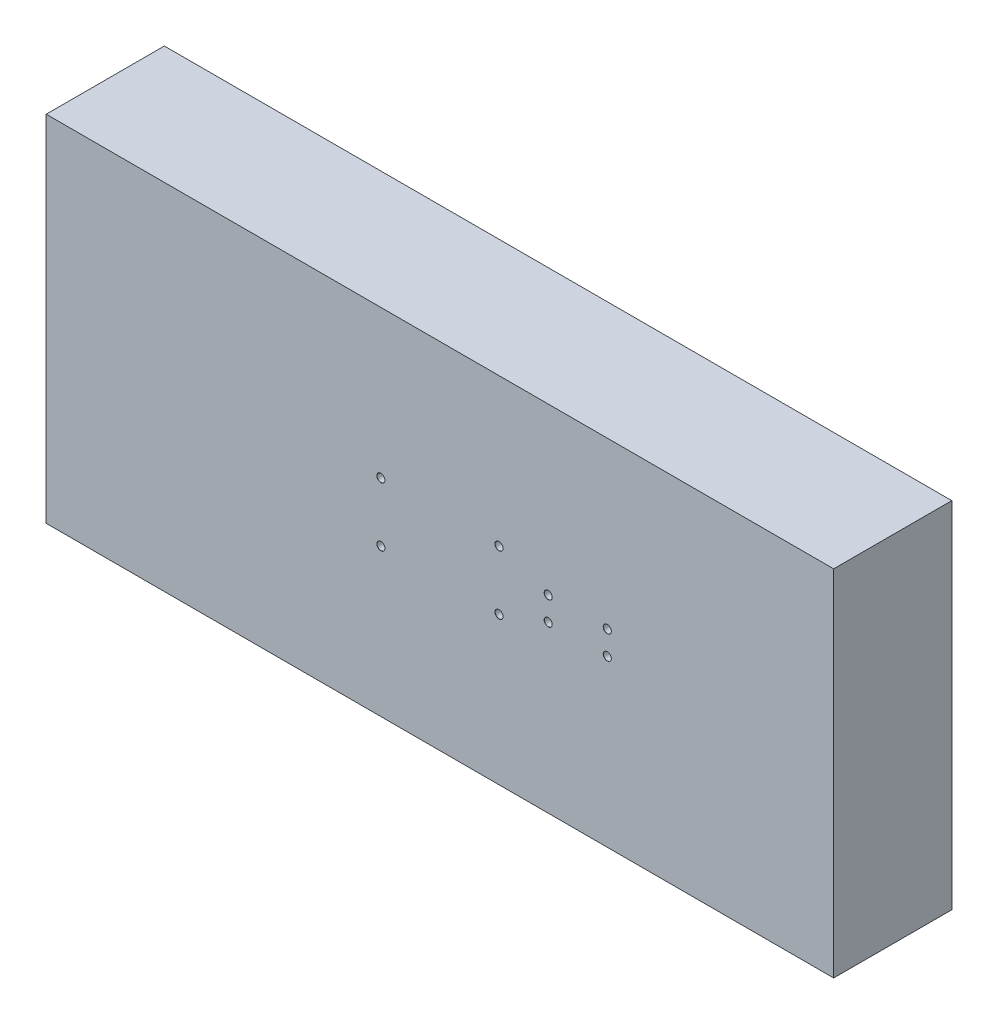
ISO-10303-21;
HEADER;
FILE_DESCRIPTION(('STEP AP214'),'2;1');
FILE_NAME('part.step','',(''),(''),'','','');
FILE_SCHEMA(('AUTOMOTIVE_DESIGN { 1 0 10303 214 1 1 1 1 }'));
ENDSEC;
DATA;
#1=APPLICATION_CONTEXT('core data for automotive mechanical design processes');
#2=APPLICATION_PROTOCOL_DEFINITION('international standard','automotive_design',2000,#1);
#3=PRODUCT_CONTEXT('',#1,'mechanical');
#4=PRODUCT('Part','Part','',(#3));
#5=PRODUCT_RELATED_PRODUCT_CATEGORY('part','',(#4));
#6=PRODUCT_DEFINITION_FORMATION('','',#4);
#7=PRODUCT_DEFINITION_CONTEXT('part definition',#1,'design');
#8=PRODUCT_DEFINITION('design','',#6,#7);
#9=PRODUCT_DEFINITION_SHAPE('','',#8);
#10=(LENGTH_UNIT() NAMED_UNIT(*) SI_UNIT(.MILLI.,.METRE.));
#11=(NAMED_UNIT(*) PLANE_ANGLE_UNIT() SI_UNIT($,.RADIAN.));
#12=(NAMED_UNIT(*) SI_UNIT($,.STERADIAN.) SOLID_ANGLE_UNIT());
#13=UNCERTAINTY_MEASURE_WITH_UNIT(LENGTH_MEASURE(1.E-05),#10,'distance_accuracy_value','');
#14=(GEOMETRIC_REPRESENTATION_CONTEXT(3) GLOBAL_UNCERTAINTY_ASSIGNED_CONTEXT((#13)) GLOBAL_UNIT_ASSIGNED_CONTEXT((#10,
#11,#12)) REPRESENTATION_CONTEXT('',''));
#15=CARTESIAN_POINT('',(0.,0.,0.));
#16=DIRECTION('',(0.,0.,1.));
#17=DIRECTION('',(1.,0.,0.));
#18=AXIS2_PLACEMENT_3D('',#15,#16,#17);
#19=CARTESIAN_POINT('',(-100.,0.,0.));
#20=DIRECTION('',(0.,-1.,0.));
#21=DIRECTION('',(0.,0.,-1.));
#22=AXIS2_PLACEMENT_3D('',#19,#20,#21);
#23=PLANE('',#22);
#24=DIRECTION('',(1.,0.,0.));
#25=VECTOR('',#24,1.);
#26=CARTESIAN_POINT('',(-100.,0.,30.));
#27=LINE('',#26,#25);
#28=CARTESIAN_POINT('',(-100.,0.,30.));
#29=VERTEX_POINT('',#28);
#30=CARTESIAN_POINT('',(100.,0.,30.));
#31=VERTEX_POINT('',#30);
#32=EDGE_CURVE('E46',#29,#31,#27,.T.);
#33=ORIENTED_EDGE('',*,*,#32,.T.);
#34=DIRECTION('',(0.,0.,-1.));
#35=VECTOR('',#34,1.);
#36=CARTESIAN_POINT('',(100.,0.,0.));
#37=LINE('',#36,#35);
#38=CARTESIAN_POINT('',(100.,0.,0.));
#39=VERTEX_POINT('',#38);
#40=EDGE_CURVE('E190',#31,#39,#37,.T.);
#41=ORIENTED_EDGE('',*,*,#40,.T.);
#42=DIRECTION('',(1.,0.,0.));
#43=VECTOR('',#42,1.);
#44=CARTESIAN_POINT('',(-100.,0.,0.));
#45=LINE('',#44,#43);
#46=CARTESIAN_POINT('',(-100.,0.,0.));
#47=VERTEX_POINT('',#46);
#48=EDGE_CURVE('E11',#47,#39,#45,.T.);
#49=ORIENTED_EDGE('',*,*,#48,.F.);
#50=DIRECTION('',(0.,0.,-1.));
#51=VECTOR('',#50,1.);
#52=CARTESIAN_POINT('',(-100.,0.,0.));
#53=LINE('',#52,#51);
#54=EDGE_CURVE('E56',#29,#47,#53,.T.);
#55=ORIENTED_EDGE('',*,*,#54,.F.);
#56=EDGE_LOOP('',(#33,#41,#49,#55));
#57=FACE_BOUND('',#56,.T.);
#58=ADVANCED_FACE('F43',(#57),#23,.F.);
#59=CARTESIAN_POINT('',(-100.,0.,0.));
#60=DIRECTION('',(0.,0.,-1.));
#61=DIRECTION('',(0.,1.,0.));
#62=AXIS2_PLACEMENT_3D('',#59,#60,#61);
#63=PLANE('',#62);
#64=ORIENTED_EDGE('',*,*,#48,.T.);
#65=DIRECTION('',(0.,1.,0.));
#66=VECTOR('',#65,1.);
#67=CARTESIAN_POINT('',(100.,0.,0.));
#68=LINE('',#67,#66);
#69=CARTESIAN_POINT('',(100.,-90.,0.));
#70=VERTEX_POINT('',#69);
#71=EDGE_CURVE('E197',#70,#39,#68,.T.);
#72=ORIENTED_EDGE('',*,*,#71,.F.);
#73=DIRECTION('',(1.,0.,0.));
#74=VECTOR('',#73,1.);
#75=CARTESIAN_POINT('',(-100.,-90.,0.));
#76=LINE('',#75,#74);
#77=CARTESIAN_POINT('',(-100.,-90.,0.));
#78=VERTEX_POINT('',#77);
#79=EDGE_CURVE('E51',#78,#70,#76,.T.);
#80=ORIENTED_EDGE('',*,*,#79,.F.);
#81=DIRECTION('',(0.,1.,0.));
#82=VECTOR('',#81,1.);
#83=CARTESIAN_POINT('',(-100.,0.,0.));
#84=LINE('',#83,#82);
#85=EDGE_CURVE('E201',#78,#47,#84,.T.);
#86=ORIENTED_EDGE('',*,*,#85,.T.);
#87=EDGE_LOOP('',(#64,#72,#80,#86));
#88=FACE_BOUND('',#87,.T.);
#89=ADVANCED_FACE('F226',(#88),#63,.T.);
#90=CARTESIAN_POINT('',(-100.,-90.,0.));
#91=DIRECTION('',(0.,-1.,0.));
#92=DIRECTION('',(0.,0.,-1.));
#93=AXIS2_PLACEMENT_3D('',#90,#91,#92);
#94=PLANE('',#93);
#95=ORIENTED_EDGE('',*,*,#79,.T.);
#96=DIRECTION('',(0.,0.,-1.));
#97=VECTOR('',#96,1.);
#98=CARTESIAN_POINT('',(100.,-90.,0.));
#99=LINE('',#98,#97);
#100=CARTESIAN_POINT('',(100.,-90.,30.));
#101=VERTEX_POINT('',#100);
#102=EDGE_CURVE('E195',#101,#70,#99,.T.);
#103=ORIENTED_EDGE('',*,*,#102,.F.);
#104=DIRECTION('',(1.,0.,0.));
#105=VECTOR('',#104,1.);
#106=CARTESIAN_POINT('',(-100.,-90.,30.));
#107=LINE('',#106,#105);
#108=CARTESIAN_POINT('',(-100.,-90.,30.));
#109=VERTEX_POINT('',#108);
#110=EDGE_CURVE('E207',#109,#101,#107,.T.);
#111=ORIENTED_EDGE('',*,*,#110,.F.);
#112=DIRECTION('',(0.,0.,-1.));
#113=VECTOR('',#112,1.);
#114=CARTESIAN_POINT('',(-100.,-90.,0.));
#115=LINE('',#114,#113);
#116=EDGE_CURVE('E204',#109,#78,#115,.T.);
#117=ORIENTED_EDGE('',*,*,#116,.T.);
#118=EDGE_LOOP('',(#95,#103,#111,#117));
#119=FACE_BOUND('',#118,.T.);
#120=ADVANCED_FACE('F216',(#119),#94,.T.);
#121=CARTESIAN_POINT('',(-100.,0.,30.));
#122=DIRECTION('',(0.,0.,-1.));
#123=DIRECTION('',(-1.,0.,0.));
#124=AXIS2_PLACEMENT_3D('',#121,#122,#123);
#125=PLANE('',#124);
#126=CARTESIAN_POINT('',(27.5,-42.,30.));
#127=DIRECTION('',(0.,0.,1.));
#128=DIRECTION('',(1.,0.,0.));
#129=AXIS2_PLACEMENT_3D('',#126,#127,#128);
#130=CIRCLE('',#129,1.025);
#131=CARTESIAN_POINT('',(28.525,-42.,30.));
#132=VERTEX_POINT('',#131);
#133=EDGE_CURVE('E121',#132,#132,#130,.T.);
#134=ORIENTED_EDGE('',*,*,#133,.F.);
#135=EDGE_LOOP('',(#134));
#136=FACE_BOUND('',#135,.T.);
#137=CARTESIAN_POINT('',(27.5,-48.,30.));
#138=DIRECTION('',(0.,0.,1.));
#139=DIRECTION('',(1.,0.,0.));
#140=AXIS2_PLACEMENT_3D('',#137,#138,#139);
#141=CIRCLE('',#140,1.025);
#142=CARTESIAN_POINT('',(28.525,-48.,30.));
#143=VERTEX_POINT('',#142);
#144=EDGE_CURVE('E120',#143,#143,#141,.T.);
#145=ORIENTED_EDGE('',*,*,#144,.F.);
#146=EDGE_LOOP('',(#145));
#147=FACE_BOUND('',#146,.T.);
#148=CARTESIAN_POINT('',(42.5,-48.,30.));
#149=DIRECTION('',(0.,0.,1.));
#150=DIRECTION('',(1.,0.,0.));
#151=AXIS2_PLACEMENT_3D('',#148,#149,#150);
#152=CIRCLE('',#151,1.025);
#153=CARTESIAN_POINT('',(43.525,-48.,30.));
#154=VERTEX_POINT('',#153);
#155=EDGE_CURVE('E134',#154,#154,#152,.T.);
#156=ORIENTED_EDGE('',*,*,#155,.F.);
#157=EDGE_LOOP('',(#156));
#158=FACE_BOUND('',#157,.T.);
#159=CARTESIAN_POINT('',(42.5,-42.,30.));
#160=DIRECTION('',(0.,0.,1.));
#161=DIRECTION('',(1.,0.,0.));
#162=AXIS2_PLACEMENT_3D('',#159,#160,#161);
#163=CIRCLE('',#162,1.025);
#164=CARTESIAN_POINT('',(43.525,-42.,30.));
#165=VERTEX_POINT('',#164);
#166=EDGE_CURVE('E145',#165,#165,#163,.T.);
#167=ORIENTED_EDGE('',*,*,#166,.F.);
#168=EDGE_LOOP('',(#167));
#169=FACE_BOUND('',#168,.T.);
#170=CARTESIAN_POINT('',(-15.,-37.5,30.));
#171=DIRECTION('',(0.,0.,1.));
#172=DIRECTION('',(1.,0.,0.));
#173=AXIS2_PLACEMENT_3D('',#170,#171,#172);
#174=CIRCLE('',#173,1.025);
#175=CARTESIAN_POINT('',(-13.975,-37.5,30.));
#176=VERTEX_POINT('',#175);
#177=EDGE_CURVE('E152',#176,#176,#174,.T.);
#178=ORIENTED_EDGE('',*,*,#177,.F.);
#179=EDGE_LOOP('',(#178));
#180=FACE_BOUND('',#179,.T.);
#181=CARTESIAN_POINT('',(-15.,-52.5,30.));
#182=DIRECTION('',(0.,0.,1.));
#183=DIRECTION('',(1.,0.,0.));
#184=AXIS2_PLACEMENT_3D('',#181,#182,#183);
#185=CIRCLE('',#184,1.025);
#186=CARTESIAN_POINT('',(-13.975,-52.5,30.));
#187=VERTEX_POINT('',#186);
#188=EDGE_CURVE('E158',#187,#187,#185,.T.);
#189=ORIENTED_EDGE('',*,*,#188,.F.);
#190=EDGE_LOOP('',(#189));
#191=FACE_BOUND('',#190,.T.);
#192=CARTESIAN_POINT('',(15.,-37.5,30.));
#193=DIRECTION('',(0.,0.,1.));
#194=DIRECTION('',(1.,0.,0.));
#195=AXIS2_PLACEMENT_3D('',#192,#193,#194);
#196=CIRCLE('',#195,1.025);
#197=CARTESIAN_POINT('',(16.025,-37.5,30.));
#198=VERTEX_POINT('',#197);
#199=EDGE_CURVE('E169',#198,#198,#196,.T.);
#200=ORIENTED_EDGE('',*,*,#199,.F.);
#201=EDGE_LOOP('',(#200));
#202=FACE_BOUND('',#201,.T.);
#203=CARTESIAN_POINT('',(15.,-52.5,30.));
#204=DIRECTION('',(0.,0.,1.));
#205=DIRECTION('',(1.,0.,0.));
#206=AXIS2_PLACEMENT_3D('',#203,#204,#205);
#207=CIRCLE('',#206,1.025);
#208=CARTESIAN_POINT('',(16.025,-52.5,30.));
#209=VERTEX_POINT('',#208);
#210=EDGE_CURVE('E178',#209,#209,#207,.T.);
#211=ORIENTED_EDGE('',*,*,#210,.F.);
#212=EDGE_LOOP('',(#211));
#213=FACE_BOUND('',#212,.T.);
#214=ORIENTED_EDGE('',*,*,#110,.T.);
#215=DIRECTION('',(0.,1.,0.));
#216=VECTOR('',#215,1.);
#217=CARTESIAN_POINT('',(100.,0.,30.));
#218=LINE('',#217,#216);
#219=EDGE_CURVE('E188',#101,#31,#218,.T.);
#220=ORIENTED_EDGE('',*,*,#219,.T.);
#221=ORIENTED_EDGE('',*,*,#32,.F.);
#222=DIRECTION('',(0.,1.,0.));
#223=VECTOR('',#222,1.);
#224=CARTESIAN_POINT('',(-100.,0.,30.));
#225=LINE('',#224,#223);
#226=EDGE_CURVE('E198',#109,#29,#225,.T.);
#227=ORIENTED_EDGE('',*,*,#226,.F.);
#228=EDGE_LOOP('',(#214,#220,#221,#227));
#229=FACE_BOUND('',#228,.T.);
#230=ADVANCED_FACE('F217',(#136,#147,#158,#169,#180,#191,#202,#213,#229),#125,.F.);
#231=CARTESIAN_POINT('',(-100.,0.,0.));
#232=DIRECTION('',(1.,0.,0.));
#233=DIRECTION('',(0.,0.,-1.));
#234=AXIS2_PLACEMENT_3D('',#231,#232,#233);
#235=PLANE('',#234);
#236=ORIENTED_EDGE('',*,*,#54,.T.);
#237=ORIENTED_EDGE('',*,*,#85,.F.);
#238=ORIENTED_EDGE('',*,*,#116,.F.);
#239=ORIENTED_EDGE('',*,*,#226,.T.);
#240=EDGE_LOOP('',(#236,#237,#238,#239));
#241=FACE_BOUND('',#240,.T.);
#242=ADVANCED_FACE('F219',(#241),#235,.F.);
#243=CARTESIAN_POINT('',(100.,0.,0.));
#244=DIRECTION('',(1.,0.,0.));
#245=DIRECTION('',(0.,0.,-1.));
#246=AXIS2_PLACEMENT_3D('',#243,#244,#245);
#247=PLANE('',#246);
#248=ORIENTED_EDGE('',*,*,#40,.F.);
#249=ORIENTED_EDGE('',*,*,#219,.F.);
#250=ORIENTED_EDGE('',*,*,#102,.T.);
#251=ORIENTED_EDGE('',*,*,#71,.T.);
#252=EDGE_LOOP('',(#248,#249,#250,#251));
#253=FACE_BOUND('',#252,.T.);
#254=ADVANCED_FACE('F212',(#253),#247,.T.);
#255=CARTESIAN_POINT('',(15.,-52.5,20.));
#256=DIRECTION('',(0.,0.,1.));
#257=DIRECTION('',(1.,0.,0.));
#258=AXIS2_PLACEMENT_3D('',#255,#256,#257);
#259=CONICAL_SURFACE('',#258,0.999999999999987,1.02974425867664);
#260=CARTESIAN_POINT('',(15.,-52.5,19.3991393809724));
#261=VERTEX_POINT('',#260);
#262=VERTEX_LOOP('',#261);
#263=FACE_BOUND('',#262,.T.);
#264=CARTESIAN_POINT('',(15.,-52.5,20.));
#265=DIRECTION('',(0.,0.,1.));
#266=DIRECTION('',(1.,0.,0.));
#267=AXIS2_PLACEMENT_3D('',#264,#265,#266);
#268=CIRCLE('',#267,0.999999999999987);
#269=CARTESIAN_POINT('',(16.,-52.5,20.));
#270=VERTEX_POINT('',#269);
#271=EDGE_CURVE('E183',#270,#270,#268,.T.);
#272=ORIENTED_EDGE('',*,*,#271,.T.);
#273=EDGE_LOOP('',(#272));
#274=FACE_BOUND('',#273,.T.);
#275=ADVANCED_FACE('F243',(#263,#274),#259,.F.);
#276=CARTESIAN_POINT('',(15.,-52.5,30.));
#277=DIRECTION('',(0.,0.,1.));
#278=DIRECTION('',(1.,0.,0.));
#279=AXIS2_PLACEMENT_3D('',#276,#277,#278);
#280=CYLINDRICAL_SURFACE('',#279,0.999999999999987);
#281=ORIENTED_EDGE('',*,*,#271,.F.);
#282=EDGE_LOOP('',(#281));
#283=FACE_BOUND('',#282,.T.);
#284=CARTESIAN_POINT('',(15.,-52.5,29.975));
#285=DIRECTION('',(0.,0.,1.));
#286=DIRECTION('',(1.,0.,0.));
#287=AXIS2_PLACEMENT_3D('',#284,#285,#286);
#288=CIRCLE('',#287,0.999999999999987);
#289=CARTESIAN_POINT('',(16.,-52.5,29.975));
#290=VERTEX_POINT('',#289);
#291=EDGE_CURVE('E181',#290,#290,#288,.T.);
#292=ORIENTED_EDGE('',*,*,#291,.T.);
#293=EDGE_LOOP('',(#292));
#294=FACE_BOUND('',#293,.T.);
#295=ADVANCED_FACE('F246',(#283,#294),#280,.F.);
#296=CARTESIAN_POINT('',(15.,-52.5,30.));
#297=DIRECTION('',(0.,0.,1.));
#298=DIRECTION('',(1.,0.,0.));
#299=AXIS2_PLACEMENT_3D('',#296,#297,#298);
#300=CONICAL_SURFACE('',#299,1.025,0.785398163397379);
#301=ORIENTED_EDGE('',*,*,#291,.F.);
#302=EDGE_LOOP('',(#301));
#303=FACE_BOUND('',#302,.T.);
#304=ORIENTED_EDGE('',*,*,#210,.T.);
#305=EDGE_LOOP('',(#304));
#306=FACE_BOUND('',#305,.T.);
#307=ADVANCED_FACE('F249',(#303,#306),#300,.F.);
#308=CARTESIAN_POINT('',(15.,-37.5,20.));
#309=DIRECTION('',(0.,0.,1.));
#310=DIRECTION('',(1.,0.,0.));
#311=AXIS2_PLACEMENT_3D('',#308,#309,#310);
#312=CONICAL_SURFACE('',#311,0.999999999999987,1.02974425867664);
#313=CARTESIAN_POINT('',(15.,-37.5,19.3991393809724));
#314=VERTEX_POINT('',#313);
#315=VERTEX_LOOP('',#314);
#316=FACE_BOUND('',#315,.T.);
#317=CARTESIAN_POINT('',(15.,-37.5,20.));
#318=DIRECTION('',(0.,0.,1.));
#319=DIRECTION('',(1.,0.,0.));
#320=AXIS2_PLACEMENT_3D('',#317,#318,#319);
#321=CIRCLE('',#320,0.999999999999987);
#322=CARTESIAN_POINT('',(16.,-37.5,20.));
#323=VERTEX_POINT('',#322);
#324=EDGE_CURVE('E174',#323,#323,#321,.T.);
#325=ORIENTED_EDGE('',*,*,#324,.T.);
#326=EDGE_LOOP('',(#325));
#327=FACE_BOUND('',#326,.T.);
#328=ADVANCED_FACE('F251',(#316,#327),#312,.F.);
#329=CARTESIAN_POINT('',(15.,-37.5,30.));
#330=DIRECTION('',(0.,0.,1.));
#331=DIRECTION('',(1.,0.,0.));
#332=AXIS2_PLACEMENT_3D('',#329,#330,#331);
#333=CYLINDRICAL_SURFACE('',#332,0.999999999999987);
#334=ORIENTED_EDGE('',*,*,#324,.F.);
#335=EDGE_LOOP('',(#334));
#336=FACE_BOUND('',#335,.T.);
#337=CARTESIAN_POINT('',(15.,-37.5,29.975));
#338=DIRECTION('',(0.,0.,1.));
#339=DIRECTION('',(1.,0.,0.));
#340=AXIS2_PLACEMENT_3D('',#337,#338,#339);
#341=CIRCLE('',#340,0.999999999999987);
#342=CARTESIAN_POINT('',(16.,-37.5,29.975));
#343=VERTEX_POINT('',#342);
#344=EDGE_CURVE('E175',#343,#343,#341,.T.);
#345=ORIENTED_EDGE('',*,*,#344,.T.);
#346=EDGE_LOOP('',(#345));
#347=FACE_BOUND('',#346,.T.);
#348=ADVANCED_FACE('F260',(#336,#347),#333,.F.);
#349=CARTESIAN_POINT('',(15.,-37.5,30.));
#350=DIRECTION('',(0.,0.,1.));
#351=DIRECTION('',(1.,0.,0.));
#352=AXIS2_PLACEMENT_3D('',#349,#350,#351);
#353=CONICAL_SURFACE('',#352,1.025,0.785398163397379);
#354=ORIENTED_EDGE('',*,*,#344,.F.);
#355=EDGE_LOOP('',(#354));
#356=FACE_BOUND('',#355,.T.);
#357=ORIENTED_EDGE('',*,*,#199,.T.);
#358=EDGE_LOOP('',(#357));
#359=FACE_BOUND('',#358,.T.);
#360=ADVANCED_FACE('F265',(#356,#359),#353,.F.);
#361=CARTESIAN_POINT('',(-15.,-52.5,20.));
#362=DIRECTION('',(0.,0.,1.));
#363=DIRECTION('',(1.,0.,0.));
#364=AXIS2_PLACEMENT_3D('',#361,#362,#363);
#365=CONICAL_SURFACE('',#364,0.999999999999987,1.02974425867664);
#366=CARTESIAN_POINT('',(-15.,-52.5,19.3991393809724));
#367=VERTEX_POINT('',#366);
#368=VERTEX_LOOP('',#367);
#369=FACE_BOUND('',#368,.T.);
#370=CARTESIAN_POINT('',(-15.,-52.5,20.));
#371=DIRECTION('',(0.,0.,1.));
#372=DIRECTION('',(1.,0.,0.));
#373=AXIS2_PLACEMENT_3D('',#370,#371,#372);
#374=CIRCLE('',#373,0.999999999999987);
#375=CARTESIAN_POINT('',(-14.,-52.5,20.));
#376=VERTEX_POINT('',#375);
#377=EDGE_CURVE('E168',#376,#376,#374,.T.);
#378=ORIENTED_EDGE('',*,*,#377,.T.);
#379=EDGE_LOOP('',(#378));
#380=FACE_BOUND('',#379,.T.);
#381=ADVANCED_FACE('F267',(#369,#380),#365,.F.);
#382=CARTESIAN_POINT('',(-15.,-52.5,30.));
#383=DIRECTION('',(0.,0.,1.));
#384=DIRECTION('',(1.,0.,0.));
#385=AXIS2_PLACEMENT_3D('',#382,#383,#384);
#386=CYLINDRICAL_SURFACE('',#385,0.999999999999988);
#387=ORIENTED_EDGE('',*,*,#377,.F.);
#388=EDGE_LOOP('',(#387));
#389=FACE_BOUND('',#388,.T.);
#390=CARTESIAN_POINT('',(-15.,-52.5,29.975));
#391=DIRECTION('',(0.,0.,1.));
#392=DIRECTION('',(1.,0.,0.));
#393=AXIS2_PLACEMENT_3D('',#390,#391,#392);
#394=CIRCLE('',#393,0.999999999999989);
#395=CARTESIAN_POINT('',(-14.,-52.5,29.975));
#396=VERTEX_POINT('',#395);
#397=EDGE_CURVE('E161',#396,#396,#394,.T.);
#398=ORIENTED_EDGE('',*,*,#397,.T.);
#399=EDGE_LOOP('',(#398));
#400=FACE_BOUND('',#399,.T.);
#401=ADVANCED_FACE('F268',(#389,#400),#386,.F.);
#402=CARTESIAN_POINT('',(-15.,-52.5,30.));
#403=DIRECTION('',(0.,0.,1.));
#404=DIRECTION('',(1.,0.,0.));
#405=AXIS2_PLACEMENT_3D('',#402,#403,#404);
#406=CONICAL_SURFACE('',#405,1.025,0.785398163397379);
#407=ORIENTED_EDGE('',*,*,#397,.F.);
#408=EDGE_LOOP('',(#407));
#409=FACE_BOUND('',#408,.T.);
#410=ORIENTED_EDGE('',*,*,#188,.T.);
#411=EDGE_LOOP('',(#410));
#412=FACE_BOUND('',#411,.T.);
#413=ADVANCED_FACE('F274',(#409,#412),#406,.F.);
#414=CARTESIAN_POINT('',(-15.,-37.5,20.));
#415=DIRECTION('',(0.,0.,1.));
#416=DIRECTION('',(1.,0.,0.));
#417=AXIS2_PLACEMENT_3D('',#414,#415,#416);
#418=CONICAL_SURFACE('',#417,0.999999999999987,1.02974425867664);
#419=CARTESIAN_POINT('',(-15.,-37.5,19.3991393809724));
#420=VERTEX_POINT('',#419);
#421=VERTEX_LOOP('',#420);
#422=FACE_BOUND('',#421,.T.);
#423=CARTESIAN_POINT('',(-15.,-37.5,20.));
#424=DIRECTION('',(0.,0.,1.));
#425=DIRECTION('',(1.,0.,0.));
#426=AXIS2_PLACEMENT_3D('',#423,#424,#425);
#427=CIRCLE('',#426,0.999999999999987);
#428=CARTESIAN_POINT('',(-14.,-37.5,20.));
#429=VERTEX_POINT('',#428);
#430=EDGE_CURVE('E159',#429,#429,#427,.T.);
#431=ORIENTED_EDGE('',*,*,#430,.T.);
#432=EDGE_LOOP('',(#431));
#433=FACE_BOUND('',#432,.T.);
#434=ADVANCED_FACE('F280',(#422,#433),#418,.F.);
#435=CARTESIAN_POINT('',(-15.,-37.5,30.));
#436=DIRECTION('',(0.,0.,1.));
#437=DIRECTION('',(1.,0.,0.));
#438=AXIS2_PLACEMENT_3D('',#435,#436,#437);
#439=CYLINDRICAL_SURFACE('',#438,0.999999999999988);
#440=ORIENTED_EDGE('',*,*,#430,.F.);
#441=EDGE_LOOP('',(#440));
#442=FACE_BOUND('',#441,.T.);
#443=CARTESIAN_POINT('',(-15.,-37.5,29.975));
#444=DIRECTION('',(0.,0.,1.));
#445=DIRECTION('',(1.,0.,0.));
#446=AXIS2_PLACEMENT_3D('',#443,#444,#445);
#447=CIRCLE('',#446,0.999999999999989);
#448=CARTESIAN_POINT('',(-14.,-37.5,29.975));
#449=VERTEX_POINT('',#448);
#450=EDGE_CURVE('E151',#449,#449,#447,.T.);
#451=ORIENTED_EDGE('',*,*,#450,.T.);
#452=EDGE_LOOP('',(#451));
#453=FACE_BOUND('',#452,.T.);
#454=ADVANCED_FACE('F285',(#442,#453),#439,.F.);
#455=CARTESIAN_POINT('',(-15.,-37.5,30.));
#456=DIRECTION('',(0.,0.,1.));
#457=DIRECTION('',(1.,0.,0.));
#458=AXIS2_PLACEMENT_3D('',#455,#456,#457);
#459=CONICAL_SURFACE('',#458,1.025,0.785398163397379);
#460=ORIENTED_EDGE('',*,*,#450,.F.);
#461=EDGE_LOOP('',(#460));
#462=FACE_BOUND('',#461,.T.);
#463=ORIENTED_EDGE('',*,*,#177,.T.);
#464=EDGE_LOOP('',(#463));
#465=FACE_BOUND('',#464,.T.);
#466=ADVANCED_FACE('F287',(#462,#465),#459,.F.);
#467=CARTESIAN_POINT('',(42.5,-42.,20.));
#468=DIRECTION('',(0.,0.,1.));
#469=DIRECTION('',(1.,0.,0.));
#470=AXIS2_PLACEMENT_3D('',#467,#468,#469);
#471=CONICAL_SURFACE('',#470,0.999999999999994,1.02974425867665);
#472=CARTESIAN_POINT('',(42.5,-42.,19.3991393809724));
#473=VERTEX_POINT('',#472);
#474=VERTEX_LOOP('',#473);
#475=FACE_BOUND('',#474,.T.);
#476=CARTESIAN_POINT('',(42.5,-42.,20.));
#477=DIRECTION('',(0.,0.,1.));
#478=DIRECTION('',(1.,0.,0.));
#479=AXIS2_PLACEMENT_3D('',#476,#477,#478);
#480=CIRCLE('',#479,0.999999999999994);
#481=CARTESIAN_POINT('',(43.5,-42.,20.));
#482=VERTEX_POINT('',#481);
#483=EDGE_CURVE('E150',#482,#482,#480,.T.);
#484=ORIENTED_EDGE('',*,*,#483,.T.);
#485=EDGE_LOOP('',(#484));
#486=FACE_BOUND('',#485,.T.);
#487=ADVANCED_FACE('F286',(#475,#486),#471,.F.);
#488=CARTESIAN_POINT('',(42.5,-42.,30.));
#489=DIRECTION('',(0.,0.,1.));
#490=DIRECTION('',(1.,0.,0.));
#491=AXIS2_PLACEMENT_3D('',#488,#489,#490);
#492=CYLINDRICAL_SURFACE('',#491,0.999999999999994);
#493=ORIENTED_EDGE('',*,*,#483,.F.);
#494=EDGE_LOOP('',(#493));
#495=FACE_BOUND('',#494,.T.);
#496=CARTESIAN_POINT('',(42.5,-42.,29.975));
#497=DIRECTION('',(0.,0.,1.));
#498=DIRECTION('',(1.,0.,0.));
#499=AXIS2_PLACEMENT_3D('',#496,#497,#498);
#500=CIRCLE('',#499,0.999999999999994);
#501=CARTESIAN_POINT('',(43.5,-42.,29.975));
#502=VERTEX_POINT('',#501);
#503=EDGE_CURVE('E143',#502,#502,#500,.T.);
#504=ORIENTED_EDGE('',*,*,#503,.T.);
#505=EDGE_LOOP('',(#504));
#506=FACE_BOUND('',#505,.T.);
#507=ADVANCED_FACE('F292',(#495,#506),#492,.F.);
#508=CARTESIAN_POINT('',(42.5,-42.,30.));
#509=DIRECTION('',(0.,0.,1.));
#510=DIRECTION('',(1.,0.,0.));
#511=AXIS2_PLACEMENT_3D('',#508,#509,#510);
#512=CONICAL_SURFACE('',#511,1.025,0.785398163397379);
#513=ORIENTED_EDGE('',*,*,#503,.F.);
#514=EDGE_LOOP('',(#513));
#515=FACE_BOUND('',#514,.T.);
#516=ORIENTED_EDGE('',*,*,#166,.T.);
#517=EDGE_LOOP('',(#516));
#518=FACE_BOUND('',#517,.T.);
#519=ADVANCED_FACE('F298',(#515,#518),#512,.F.);
#520=CARTESIAN_POINT('',(42.5,-48.,20.));
#521=DIRECTION('',(0.,0.,1.));
#522=DIRECTION('',(1.,0.,0.));
#523=AXIS2_PLACEMENT_3D('',#520,#521,#522);
#524=CONICAL_SURFACE('',#523,0.999999999999994,1.02974425867665);
#525=CARTESIAN_POINT('',(42.5,-48.,19.3991393809724));
#526=VERTEX_POINT('',#525);
#527=VERTEX_LOOP('',#526);
#528=FACE_BOUND('',#527,.T.);
#529=CARTESIAN_POINT('',(42.5,-48.,20.));
#530=DIRECTION('',(0.,0.,1.));
#531=DIRECTION('',(1.,0.,0.));
#532=AXIS2_PLACEMENT_3D('',#529,#530,#531);
#533=CIRCLE('',#532,0.999999999999994);
#534=CARTESIAN_POINT('',(43.5,-48.,20.));
#535=VERTEX_POINT('',#534);
#536=EDGE_CURVE('E136',#535,#535,#533,.T.);
#537=ORIENTED_EDGE('',*,*,#536,.T.);
#538=EDGE_LOOP('',(#537));
#539=FACE_BOUND('',#538,.T.);
#540=ADVANCED_FACE('F297',(#528,#539),#524,.F.);
#541=CARTESIAN_POINT('',(42.5,-48.,30.));
#542=DIRECTION('',(0.,0.,1.));
#543=DIRECTION('',(1.,0.,0.));
#544=AXIS2_PLACEMENT_3D('',#541,#542,#543);
#545=CYLINDRICAL_SURFACE('',#544,0.999999999999994);
#546=ORIENTED_EDGE('',*,*,#536,.F.);
#547=EDGE_LOOP('',(#546));
#548=FACE_BOUND('',#547,.T.);
#549=CARTESIAN_POINT('',(42.5,-48.,29.975));
#550=DIRECTION('',(0.,0.,1.));
#551=DIRECTION('',(1.,0.,0.));
#552=AXIS2_PLACEMENT_3D('',#549,#550,#551);
#553=CIRCLE('',#552,0.999999999999994);
#554=CARTESIAN_POINT('',(43.5,-48.,29.975));
#555=VERTEX_POINT('',#554);
#556=EDGE_CURVE('E137',#555,#555,#553,.T.);
#557=ORIENTED_EDGE('',*,*,#556,.T.);
#558=EDGE_LOOP('',(#557));
#559=FACE_BOUND('',#558,.T.);
#560=ADVANCED_FACE('F302',(#548,#559),#545,.F.);
#561=CARTESIAN_POINT('',(42.5,-48.,30.));
#562=DIRECTION('',(0.,0.,1.));
#563=DIRECTION('',(1.,0.,0.));
#564=AXIS2_PLACEMENT_3D('',#561,#562,#563);
#565=CONICAL_SURFACE('',#564,1.025,0.785398163397379);
#566=ORIENTED_EDGE('',*,*,#556,.F.);
#567=EDGE_LOOP('',(#566));
#568=FACE_BOUND('',#567,.T.);
#569=ORIENTED_EDGE('',*,*,#155,.T.);
#570=EDGE_LOOP('',(#569));
#571=FACE_BOUND('',#570,.T.);
#572=ADVANCED_FACE('F308',(#568,#571),#565,.F.);
#573=CARTESIAN_POINT('',(27.5,-48.,20.));
#574=DIRECTION('',(0.,0.,1.));
#575=DIRECTION('',(1.,0.,0.));
#576=AXIS2_PLACEMENT_3D('',#573,#574,#575);
#577=CONICAL_SURFACE('',#576,0.999999999999994,1.02974425867665);
#578=CARTESIAN_POINT('',(27.5,-48.,19.3991393809724));
#579=VERTEX_POINT('',#578);
#580=VERTEX_LOOP('',#579);
#581=FACE_BOUND('',#580,.T.);
#582=CARTESIAN_POINT('',(27.5,-48.,20.));
#583=DIRECTION('',(0.,0.,1.));
#584=DIRECTION('',(1.,0.,0.));
#585=AXIS2_PLACEMENT_3D('',#582,#583,#584);
#586=CIRCLE('',#585,0.999999999999994);
#587=CARTESIAN_POINT('',(28.5,-48.,20.));
#588=VERTEX_POINT('',#587);
#589=EDGE_CURVE('E127',#588,#588,#586,.T.);
#590=ORIENTED_EDGE('',*,*,#589,.T.);
#591=EDGE_LOOP('',(#590));
#592=FACE_BOUND('',#591,.T.);
#593=ADVANCED_FACE('F315',(#581,#592),#577,.F.);
#594=CARTESIAN_POINT('',(27.5,-48.,30.));
#595=DIRECTION('',(0.,0.,1.));
#596=DIRECTION('',(1.,0.,0.));
#597=AXIS2_PLACEMENT_3D('',#594,#595,#596);
#598=CYLINDRICAL_SURFACE('',#597,0.999999999999996);
#599=ORIENTED_EDGE('',*,*,#589,.F.);
#600=EDGE_LOOP('',(#599));
#601=FACE_BOUND('',#600,.T.);
#602=CARTESIAN_POINT('',(27.5,-48.,29.975));
#603=DIRECTION('',(0.,0.,1.));
#604=DIRECTION('',(1.,0.,0.));
#605=AXIS2_PLACEMENT_3D('',#602,#603,#604);
#606=CIRCLE('',#605,0.999999999999997);
#607=CARTESIAN_POINT('',(28.5,-48.,29.975));
#608=VERTEX_POINT('',#607);
#609=EDGE_CURVE('E122',#608,#608,#606,.T.);
#610=ORIENTED_EDGE('',*,*,#609,.T.);
#611=EDGE_LOOP('',(#610));
#612=FACE_BOUND('',#611,.T.);
#613=ADVANCED_FACE('F317',(#601,#612),#598,.F.);
#614=CARTESIAN_POINT('',(27.5,-48.,30.));
#615=DIRECTION('',(0.,0.,1.));
#616=DIRECTION('',(1.,0.,0.));
#617=AXIS2_PLACEMENT_3D('',#614,#615,#616);
#618=CONICAL_SURFACE('',#617,1.025,0.78539816339731);
#619=ORIENTED_EDGE('',*,*,#609,.F.);
#620=EDGE_LOOP('',(#619));
#621=FACE_BOUND('',#620,.T.);
#622=ORIENTED_EDGE('',*,*,#144,.T.);
#623=EDGE_LOOP('',(#622));
#624=FACE_BOUND('',#623,.T.);
#625=ADVANCED_FACE('F111',(#621,#624),#618,.F.);
#626=CARTESIAN_POINT('',(27.5,-42.,20.));
#627=DIRECTION('',(0.,0.,1.));
#628=DIRECTION('',(1.,0.,0.));
#629=AXIS2_PLACEMENT_3D('',#626,#627,#628);
#630=CONICAL_SURFACE('',#629,0.999999999999994,1.02974425867665);
#631=CARTESIAN_POINT('',(27.5,-42.,19.3991393809724));
#632=VERTEX_POINT('',#631);
#633=VERTEX_LOOP('',#632);
#634=FACE_BOUND('',#633,.T.);
#635=CARTESIAN_POINT('',(27.5,-42.,20.));
#636=DIRECTION('',(0.,0.,1.));
#637=DIRECTION('',(1.,0.,0.));
#638=AXIS2_PLACEMENT_3D('',#635,#636,#637);
#639=CIRCLE('',#638,0.999999999999994);
#640=CARTESIAN_POINT('',(28.5,-42.,20.));
#641=VERTEX_POINT('',#640);
#642=EDGE_CURVE('E114',#641,#641,#639,.T.);
#643=ORIENTED_EDGE('',*,*,#642,.T.);
#644=EDGE_LOOP('',(#643));
#645=FACE_BOUND('',#644,.T.);
#646=ADVANCED_FACE('F110',(#634,#645),#630,.F.);
#647=CARTESIAN_POINT('',(27.5,-42.,30.));
#648=DIRECTION('',(0.,0.,1.));
#649=DIRECTION('',(1.,0.,0.));
#650=AXIS2_PLACEMENT_3D('',#647,#648,#649);
#651=CYLINDRICAL_SURFACE('',#650,0.999999999999996);
#652=ORIENTED_EDGE('',*,*,#642,.F.);
#653=EDGE_LOOP('',(#652));
#654=FACE_BOUND('',#653,.T.);
#655=CARTESIAN_POINT('',(27.5,-42.,29.975));
#656=DIRECTION('',(0.,0.,1.));
#657=DIRECTION('',(1.,0.,0.));
#658=AXIS2_PLACEMENT_3D('',#655,#656,#657);
#659=CIRCLE('',#658,0.999999999999997);
#660=CARTESIAN_POINT('',(28.5,-42.,29.975));
#661=VERTEX_POINT('',#660);
#662=EDGE_CURVE('E117',#661,#661,#659,.T.);
#663=ORIENTED_EDGE('',*,*,#662,.T.);
#664=EDGE_LOOP('',(#663));
#665=FACE_BOUND('',#664,.T.);
#666=ADVANCED_FACE('F109',(#654,#665),#651,.F.);
#667=CARTESIAN_POINT('',(27.5,-42.,30.));
#668=DIRECTION('',(0.,0.,1.));
#669=DIRECTION('',(1.,0.,0.));
#670=AXIS2_PLACEMENT_3D('',#667,#668,#669);
#671=CONICAL_SURFACE('',#670,1.025,0.78539816339731);
#672=ORIENTED_EDGE('',*,*,#662,.F.);
#673=EDGE_LOOP('',(#672));
#674=FACE_BOUND('',#673,.T.);
#675=ORIENTED_EDGE('',*,*,#133,.T.);
#676=EDGE_LOOP('',(#675));
#677=FACE_BOUND('',#676,.T.);
#678=ADVANCED_FACE('F327',(#674,#677),#671,.F.);
#679=CLOSED_SHELL('',(#58,#89,#120,#230,#242,#254,#275,#295,#307,#328,#348,#360,#381,#401,#413,
#434,#454,#466,#487,#507,#519,#540,#560,#572,#593,#613,#625,#646,#666,#678));
#680=MANIFOLD_SOLID_BREP('B2',#679);
#681=ADVANCED_BREP_SHAPE_REPRESENTATION('',(#18,#680),#14);
#682=SHAPE_DEFINITION_REPRESENTATION(#9,#681);
ENDSEC;
END-ISO-10303-21;
